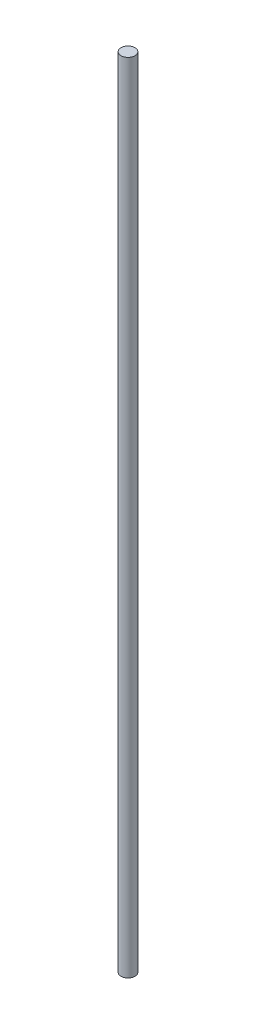
ISO-10303-21;
HEADER;
FILE_DESCRIPTION(('STEP AP214'),'2;1');
FILE_NAME('part.step','',(''),(''),'','','');
FILE_SCHEMA(('AUTOMOTIVE_DESIGN { 1 0 10303 214 1 1 1 1 }'));
ENDSEC;
DATA;
#1=APPLICATION_CONTEXT('core data for automotive mechanical design processes');
#2=APPLICATION_PROTOCOL_DEFINITION('international standard','automotive_design',2000,#1);
#3=PRODUCT_CONTEXT('',#1,'mechanical');
#4=PRODUCT('Part','Part','',(#3));
#5=PRODUCT_RELATED_PRODUCT_CATEGORY('part','',(#4));
#6=PRODUCT_DEFINITION_FORMATION('','',#4);
#7=PRODUCT_DEFINITION_CONTEXT('part definition',#1,'design');
#8=PRODUCT_DEFINITION('design','',#6,#7);
#9=PRODUCT_DEFINITION_SHAPE('','',#8);
#10=(LENGTH_UNIT() NAMED_UNIT(*) SI_UNIT(.MILLI.,.METRE.));
#11=(NAMED_UNIT(*) PLANE_ANGLE_UNIT() SI_UNIT($,.RADIAN.));
#12=(NAMED_UNIT(*) SI_UNIT($,.STERADIAN.) SOLID_ANGLE_UNIT());
#13=UNCERTAINTY_MEASURE_WITH_UNIT(LENGTH_MEASURE(1.E-05),#10,'distance_accuracy_value','');
#14=(GEOMETRIC_REPRESENTATION_CONTEXT(3) GLOBAL_UNCERTAINTY_ASSIGNED_CONTEXT((#13)) GLOBAL_UNIT_ASSIGNED_CONTEXT((#10,
#11,#12)) REPRESENTATION_CONTEXT('',''));
#15=CARTESIAN_POINT('',(0.,0.,0.));
#16=DIRECTION('',(0.,0.,1.));
#17=DIRECTION('',(1.,0.,0.));
#18=AXIS2_PLACEMENT_3D('',#15,#16,#17);
#19=CARTESIAN_POINT('',(0.,457.2,0.));
#20=DIRECTION('',(0.,-1.,0.));
#21=DIRECTION('',(0.,0.,-1.));
#22=AXIS2_PLACEMENT_3D('',#19,#20,#21);
#23=CYLINDRICAL_SURFACE('',#22,4.);
#24=CARTESIAN_POINT('',(0.,457.2,0.));
#25=DIRECTION('',(0.,1.,0.));
#26=DIRECTION('',(0.,0.,1.));
#27=AXIS2_PLACEMENT_3D('',#24,#25,#26);
#28=CIRCLE('',#27,4.);
#29=CARTESIAN_POINT('',(0.,457.2,4.));
#30=VERTEX_POINT('',#29);
#31=EDGE_CURVE('E10',#30,#30,#28,.T.);
#32=ORIENTED_EDGE('',*,*,#31,.F.);
#33=EDGE_LOOP('',(#32));
#34=FACE_BOUND('',#33,.T.);
#35=CARTESIAN_POINT('',(0.,0.,0.));
#36=DIRECTION('',(0.,1.,0.));
#37=DIRECTION('',(0.,0.,1.));
#38=AXIS2_PLACEMENT_3D('',#35,#36,#37);
#39=CIRCLE('',#38,4.);
#40=CARTESIAN_POINT('',(0.,0.,4.));
#41=VERTEX_POINT('',#40);
#42=EDGE_CURVE('E38',#41,#41,#39,.T.);
#43=ORIENTED_EDGE('',*,*,#42,.T.);
#44=EDGE_LOOP('',(#43));
#45=FACE_BOUND('',#44,.T.);
#46=ADVANCED_FACE('F35',(#34,#45),#23,.T.);
#47=CARTESIAN_POINT('',(0.,457.2,0.));
#48=DIRECTION('',(0.,1.,0.));
#49=DIRECTION('',(0.,0.,1.));
#50=AXIS2_PLACEMENT_3D('',#47,#48,#49);
#51=PLANE('',#50);
#52=ORIENTED_EDGE('',*,*,#31,.T.);
#53=EDGE_LOOP('',(#52));
#54=FACE_BOUND('',#53,.T.);
#55=ADVANCED_FACE('F50',(#54),#51,.T.);
#56=CARTESIAN_POINT('',(0.,0.,0.));
#57=DIRECTION('',(0.,1.,0.));
#58=DIRECTION('',(0.,0.,1.));
#59=AXIS2_PLACEMENT_3D('',#56,#57,#58);
#60=PLANE('',#59);
#61=ORIENTED_EDGE('',*,*,#42,.F.);
#62=EDGE_LOOP('',(#61));
#63=FACE_BOUND('',#62,.T.);
#64=ADVANCED_FACE('F48',(#63),#60,.F.);
#65=CLOSED_SHELL('',(#46,#55,#64));
#66=MANIFOLD_SOLID_BREP('B2',#65);
#67=ADVANCED_BREP_SHAPE_REPRESENTATION('',(#18,#66),#14);
#68=SHAPE_DEFINITION_REPRESENTATION(#9,#67);
ENDSEC;
END-ISO-10303-21;
